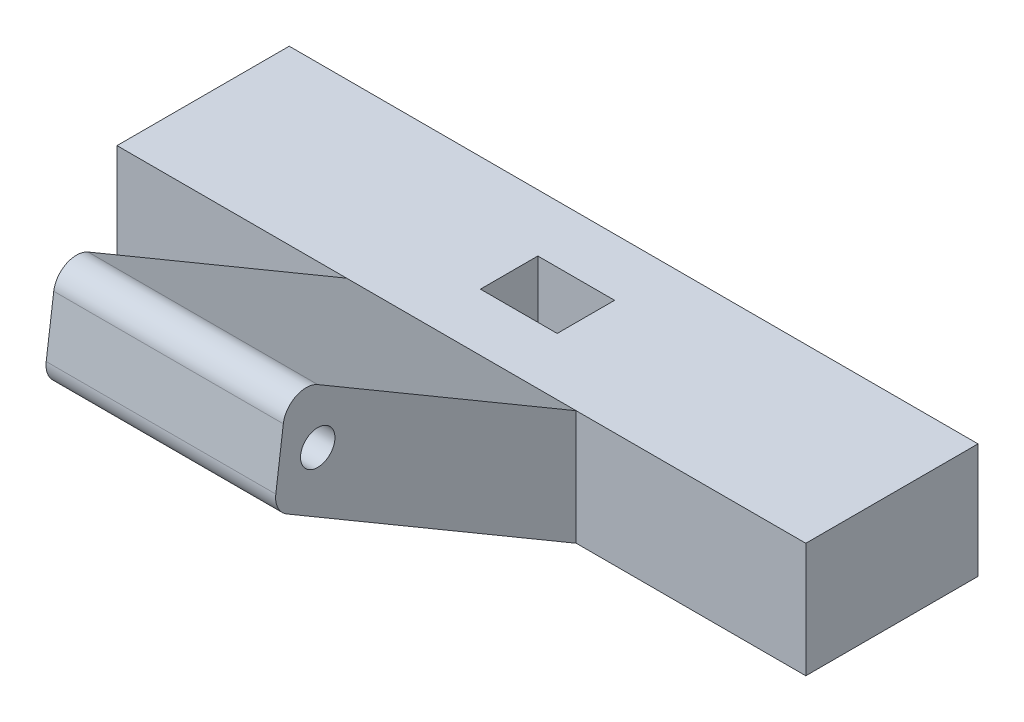
ISO-10303-21;
HEADER;
FILE_DESCRIPTION(('STEP AP214'),'2;1');
FILE_NAME('part.step','',(''),(''),'','','');
FILE_SCHEMA(('AUTOMOTIVE_DESIGN { 1 0 10303 214 1 1 1 1 }'));
ENDSEC;
DATA;
#1=APPLICATION_CONTEXT('core data for automotive mechanical design processes');
#2=APPLICATION_PROTOCOL_DEFINITION('international standard','automotive_design',2000,#1);
#3=PRODUCT_CONTEXT('',#1,'mechanical');
#4=PRODUCT('Part','Part','',(#3));
#5=PRODUCT_RELATED_PRODUCT_CATEGORY('part','',(#4));
#6=PRODUCT_DEFINITION_FORMATION('','',#4);
#7=PRODUCT_DEFINITION_CONTEXT('part definition',#1,'design');
#8=PRODUCT_DEFINITION('design','',#6,#7);
#9=PRODUCT_DEFINITION_SHAPE('','',#8);
#10=(LENGTH_UNIT() NAMED_UNIT(*) SI_UNIT(.MILLI.,.METRE.));
#11=(NAMED_UNIT(*) PLANE_ANGLE_UNIT() SI_UNIT($,.RADIAN.));
#12=(NAMED_UNIT(*) SI_UNIT($,.STERADIAN.) SOLID_ANGLE_UNIT());
#13=UNCERTAINTY_MEASURE_WITH_UNIT(LENGTH_MEASURE(1.E-05),#10,'distance_accuracy_value','');
#14=(GEOMETRIC_REPRESENTATION_CONTEXT(3) GLOBAL_UNCERTAINTY_ASSIGNED_CONTEXT((#13)) GLOBAL_UNIT_ASSIGNED_CONTEXT((#10,
#11,#12)) REPRESENTATION_CONTEXT('',''));
#15=CARTESIAN_POINT('',(0.,0.,0.));
#16=DIRECTION('',(0.,0.,1.));
#17=DIRECTION('',(1.,0.,0.));
#18=AXIS2_PLACEMENT_3D('',#15,#16,#17);
#19=CARTESIAN_POINT('',(-30.,10.,7.5));
#20=DIRECTION('',(0.,0.,-1.));
#21=DIRECTION('',(-1.,0.,0.));
#22=AXIS2_PLACEMENT_3D('',#19,#20,#21);
#23=PLANE('',#22);
#24=DIRECTION('',(0.,1.,0.));
#25=VECTOR('',#24,1.);
#26=CARTESIAN_POINT('',(10.,0.,7.5));
#27=LINE('',#26,#25);
#28=CARTESIAN_POINT('',(10.,0.,7.5));
#29=VERTEX_POINT('',#28);
#30=CARTESIAN_POINT('',(10.,10.,7.5));
#31=VERTEX_POINT('',#30);
#32=EDGE_CURVE('E217',#29,#31,#27,.T.);
#33=ORIENTED_EDGE('',*,*,#32,.F.);
#34=DIRECTION('',(1.,0.,0.));
#35=VECTOR('',#34,1.);
#36=CARTESIAN_POINT('',(-30.,0.,7.5));
#37=LINE('',#36,#35);
#38=CARTESIAN_POINT('',(30.,0.,7.5));
#39=VERTEX_POINT('',#38);
#40=EDGE_CURVE('E92',#29,#39,#37,.T.);
#41=ORIENTED_EDGE('',*,*,#40,.T.);
#42=DIRECTION('',(0.,-1.,0.));
#43=VECTOR('',#42,1.);
#44=CARTESIAN_POINT('',(30.,10.,7.5));
#45=LINE('',#44,#43);
#46=CARTESIAN_POINT('',(30.,10.,7.5));
#47=VERTEX_POINT('',#46);
#48=EDGE_CURVE('E299',#47,#39,#45,.T.);
#49=ORIENTED_EDGE('',*,*,#48,.F.);
#50=DIRECTION('',(1.,0.,0.));
#51=VECTOR('',#50,1.);
#52=CARTESIAN_POINT('',(-30.,10.,7.5));
#53=LINE('',#52,#51);
#54=EDGE_CURVE('E70',#31,#47,#53,.T.);
#55=ORIENTED_EDGE('',*,*,#54,.F.);
#56=EDGE_LOOP('',(#33,#41,#49,#55));
#57=FACE_BOUND('',#56,.T.);
#58=ADVANCED_FACE('F45',(#57),#23,.F.);
#59=CARTESIAN_POINT('',(0.,10.,0.));
#60=DIRECTION('',(0.,-1.,0.));
#61=DIRECTION('',(0.,0.,-1.));
#62=AXIS2_PLACEMENT_3D('',#59,#60,#61);
#63=PLANE('',#62);
#64=DIRECTION('',(0.,0.,1.));
#65=VECTOR('',#64,1.);
#66=CARTESIAN_POINT('',(-3.34283256,10.,2.5));
#67=LINE('',#66,#65);
#68=CARTESIAN_POINT('',(-3.34283256,10.,-2.5));
#69=VERTEX_POINT('',#68);
#70=CARTESIAN_POINT('',(-3.34283256,10.,2.5));
#71=VERTEX_POINT('',#70);
#72=EDGE_CURVE('E197',#69,#71,#67,.T.);
#73=ORIENTED_EDGE('',*,*,#72,.F.);
#74=DIRECTION('',(-1.,0.,0.));
#75=VECTOR('',#74,1.);
#76=CARTESIAN_POINT('',(-3.34283256,10.,-2.5));
#77=LINE('',#76,#75);
#78=CARTESIAN_POINT('',(3.34283256,10.,-2.5));
#79=VERTEX_POINT('',#78);
#80=EDGE_CURVE('E194',#79,#69,#77,.T.);
#81=ORIENTED_EDGE('',*,*,#80,.F.);
#82=DIRECTION('',(0.,0.,-1.));
#83=VECTOR('',#82,1.);
#84=CARTESIAN_POINT('',(3.34283256,10.,2.5));
#85=LINE('',#84,#83);
#86=CARTESIAN_POINT('',(3.34283256,10.,2.5));
#87=VERTEX_POINT('',#86);
#88=EDGE_CURVE('E175',#87,#79,#85,.T.);
#89=ORIENTED_EDGE('',*,*,#88,.F.);
#90=DIRECTION('',(1.,0.,0.));
#91=VECTOR('',#90,1.);
#92=CARTESIAN_POINT('',(-3.34283256,10.,2.5));
#93=LINE('',#92,#91);
#94=EDGE_CURVE('E170',#71,#87,#93,.T.);
#95=ORIENTED_EDGE('',*,*,#94,.F.);
#96=EDGE_LOOP('',(#73,#81,#89,#95));
#97=FACE_BOUND('',#96,.T.);
#98=DIRECTION('',(0.,0.,-1.));
#99=VECTOR('',#98,1.);
#100=CARTESIAN_POINT('',(30.,10.,7.5));
#101=LINE('',#100,#99);
#102=CARTESIAN_POINT('',(30.,10.,-7.5));
#103=VERTEX_POINT('',#102);
#104=EDGE_CURVE('E286',#47,#103,#101,.T.);
#105=ORIENTED_EDGE('',*,*,#104,.T.);
#106=DIRECTION('',(-1.,0.,0.));
#107=VECTOR('',#106,1.);
#108=CARTESIAN_POINT('',(-30.,10.,-7.5));
#109=LINE('',#108,#107);
#110=CARTESIAN_POINT('',(-30.,10.,-7.5));
#111=VERTEX_POINT('',#110);
#112=EDGE_CURVE('E99',#103,#111,#109,.T.);
#113=ORIENTED_EDGE('',*,*,#112,.T.);
#114=DIRECTION('',(0.,0.,1.));
#115=VECTOR('',#114,1.);
#116=CARTESIAN_POINT('',(-30.,10.,7.5));
#117=LINE('',#116,#115);
#118=CARTESIAN_POINT('',(-30.,10.,7.5));
#119=VERTEX_POINT('',#118);
#120=EDGE_CURVE('E292',#111,#119,#117,.T.);
#121=ORIENTED_EDGE('',*,*,#120,.T.);
#122=CARTESIAN_POINT('',(-10.,10.,7.5));
#123=VERTEX_POINT('',#122);
#124=EDGE_CURVE('E295',#119,#123,#53,.T.);
#125=ORIENTED_EDGE('',*,*,#124,.T.);
#126=DIRECTION('',(1.,0.,0.));
#127=VECTOR('',#126,1.);
#128=CARTESIAN_POINT('',(-10.,10.,7.5));
#129=LINE('',#128,#127);
#130=EDGE_CURVE('E267',#123,#31,#129,.T.);
#131=ORIENTED_EDGE('',*,*,#130,.T.);
#132=ORIENTED_EDGE('',*,*,#54,.T.);
#133=EDGE_LOOP('',(#105,#113,#121,#125,#131,#132));
#134=FACE_BOUND('',#133,.T.);
#135=ADVANCED_FACE('F330',(#97,#134),#63,.F.);
#136=CARTESIAN_POINT('',(0.,0.,0.));
#137=DIRECTION('',(0.,-1.,0.));
#138=DIRECTION('',(0.,0.,-1.));
#139=AXIS2_PLACEMENT_3D('',#136,#137,#138);
#140=PLANE('',#139);
#141=DIRECTION('',(0.,0.,1.));
#142=VECTOR('',#141,1.);
#143=CARTESIAN_POINT('',(-3.34283256,0.,2.5));
#144=LINE('',#143,#142);
#145=CARTESIAN_POINT('',(-3.34283256,0.,-2.5));
#146=VERTEX_POINT('',#145);
#147=CARTESIAN_POINT('',(-3.34283256,0.,2.5));
#148=VERTEX_POINT('',#147);
#149=EDGE_CURVE('E185',#146,#148,#144,.T.);
#150=ORIENTED_EDGE('',*,*,#149,.T.);
#151=DIRECTION('',(1.,0.,0.));
#152=VECTOR('',#151,1.);
#153=CARTESIAN_POINT('',(-3.34283256,0.,2.5));
#154=LINE('',#153,#152);
#155=CARTESIAN_POINT('',(3.34283256,0.,2.5));
#156=VERTEX_POINT('',#155);
#157=EDGE_CURVE('E165',#148,#156,#154,.T.);
#158=ORIENTED_EDGE('',*,*,#157,.T.);
#159=DIRECTION('',(0.,0.,-1.));
#160=VECTOR('',#159,1.);
#161=CARTESIAN_POINT('',(3.34283256,0.,2.5));
#162=LINE('',#161,#160);
#163=CARTESIAN_POINT('',(3.34283256,0.,-2.5));
#164=VERTEX_POINT('',#163);
#165=EDGE_CURVE('E157',#156,#164,#162,.T.);
#166=ORIENTED_EDGE('',*,*,#165,.T.);
#167=DIRECTION('',(-1.,0.,0.));
#168=VECTOR('',#167,1.);
#169=CARTESIAN_POINT('',(-3.34283256,0.,-2.5));
#170=LINE('',#169,#168);
#171=EDGE_CURVE('E162',#164,#146,#170,.T.);
#172=ORIENTED_EDGE('',*,*,#171,.T.);
#173=EDGE_LOOP('',(#150,#158,#166,#172));
#174=FACE_BOUND('',#173,.T.);
#175=DIRECTION('',(0.,0.,-1.));
#176=VECTOR('',#175,1.);
#177=CARTESIAN_POINT('',(30.,0.,7.5));
#178=LINE('',#177,#176);
#179=CARTESIAN_POINT('',(30.,0.,-7.5));
#180=VERTEX_POINT('',#179);
#181=EDGE_CURVE('E271',#39,#180,#178,.T.);
#182=ORIENTED_EDGE('',*,*,#181,.F.);
#183=ORIENTED_EDGE('',*,*,#40,.F.);
#184=DIRECTION('',(1.,0.,0.));
#185=VECTOR('',#184,1.);
#186=CARTESIAN_POINT('',(-10.,0.,7.5));
#187=LINE('',#186,#185);
#188=CARTESIAN_POINT('',(-10.,0.,7.5));
#189=VERTEX_POINT('',#188);
#190=EDGE_CURVE('E268',#189,#29,#187,.T.);
#191=ORIENTED_EDGE('',*,*,#190,.F.);
#192=CARTESIAN_POINT('',(-30.,0.,7.5));
#193=VERTEX_POINT('',#192);
#194=EDGE_CURVE('E289',#193,#189,#37,.T.);
#195=ORIENTED_EDGE('',*,*,#194,.F.);
#196=DIRECTION('',(0.,0.,1.));
#197=VECTOR('',#196,1.);
#198=CARTESIAN_POINT('',(-30.,0.,7.5));
#199=LINE('',#198,#197);
#200=CARTESIAN_POINT('',(-30.,0.,-7.5));
#201=VERTEX_POINT('',#200);
#202=EDGE_CURVE('E306',#201,#193,#199,.T.);
#203=ORIENTED_EDGE('',*,*,#202,.F.);
#204=DIRECTION('',(-1.,0.,0.));
#205=VECTOR('',#204,1.);
#206=CARTESIAN_POINT('',(-30.,0.,-7.5));
#207=LINE('',#206,#205);
#208=EDGE_CURVE('E303',#180,#201,#207,.T.);
#209=ORIENTED_EDGE('',*,*,#208,.F.);
#210=EDGE_LOOP('',(#182,#183,#191,#195,#203,#209));
#211=FACE_BOUND('',#210,.T.);
#212=ADVANCED_FACE('F159',(#174,#211),#140,.T.);
#213=CARTESIAN_POINT('',(30.,10.,7.5));
#214=DIRECTION('',(-1.,0.,0.));
#215=DIRECTION('',(0.,0.,1.));
#216=AXIS2_PLACEMENT_3D('',#213,#214,#215);
#217=PLANE('',#216);
#218=ORIENTED_EDGE('',*,*,#181,.T.);
#219=DIRECTION('',(0.,-1.,0.));
#220=VECTOR('',#219,1.);
#221=CARTESIAN_POINT('',(30.,10.,-7.5));
#222=LINE('',#221,#220);
#223=EDGE_CURVE('E11',#103,#180,#222,.T.);
#224=ORIENTED_EDGE('',*,*,#223,.F.);
#225=ORIENTED_EDGE('',*,*,#104,.F.);
#226=ORIENTED_EDGE('',*,*,#48,.T.);
#227=EDGE_LOOP('',(#218,#224,#225,#226));
#228=FACE_BOUND('',#227,.T.);
#229=ADVANCED_FACE('F47',(#228),#217,.F.);
#230=CARTESIAN_POINT('',(-30.,10.,-7.5));
#231=DIRECTION('',(0.,0.,1.));
#232=DIRECTION('',(1.,0.,0.));
#233=AXIS2_PLACEMENT_3D('',#230,#231,#232);
#234=PLANE('',#233);
#235=ORIENTED_EDGE('',*,*,#208,.T.);
#236=DIRECTION('',(0.,-1.,0.));
#237=VECTOR('',#236,1.);
#238=CARTESIAN_POINT('',(-30.,10.,-7.5));
#239=LINE('',#238,#237);
#240=EDGE_CURVE('E54',#111,#201,#239,.T.);
#241=ORIENTED_EDGE('',*,*,#240,.F.);
#242=ORIENTED_EDGE('',*,*,#112,.F.);
#243=ORIENTED_EDGE('',*,*,#223,.T.);
#244=EDGE_LOOP('',(#235,#241,#242,#243));
#245=FACE_BOUND('',#244,.T.);
#246=ADVANCED_FACE('F334',(#245),#234,.F.);
#247=CARTESIAN_POINT('',(-30.,10.,7.5));
#248=DIRECTION('',(1.,0.,0.));
#249=DIRECTION('',(0.,0.,-1.));
#250=AXIS2_PLACEMENT_3D('',#247,#248,#249);
#251=PLANE('',#250);
#252=ORIENTED_EDGE('',*,*,#202,.T.);
#253=DIRECTION('',(0.,-1.,0.));
#254=VECTOR('',#253,1.);
#255=CARTESIAN_POINT('',(-30.,10.,7.5));
#256=LINE('',#255,#254);
#257=EDGE_CURVE('E314',#119,#193,#256,.T.);
#258=ORIENTED_EDGE('',*,*,#257,.F.);
#259=ORIENTED_EDGE('',*,*,#120,.F.);
#260=ORIENTED_EDGE('',*,*,#240,.T.);
#261=EDGE_LOOP('',(#252,#258,#259,#260));
#262=FACE_BOUND('',#261,.T.);
#263=ADVANCED_FACE('F322',(#262),#251,.F.);
#264=ORIENTED_EDGE('',*,*,#194,.T.);
#265=DIRECTION('',(0.,1.,0.));
#266=VECTOR('',#265,1.);
#267=CARTESIAN_POINT('',(-10.,0.,7.5));
#268=LINE('',#267,#266);
#269=EDGE_CURVE('E245',#189,#123,#268,.T.);
#270=ORIENTED_EDGE('',*,*,#269,.T.);
#271=ORIENTED_EDGE('',*,*,#124,.F.);
#272=ORIENTED_EDGE('',*,*,#257,.T.);
#273=EDGE_LOOP('',(#264,#270,#271,#272));
#274=FACE_BOUND('',#273,.T.);
#275=ADVANCED_FACE('F328',(#274),#23,.F.);
#276=CARTESIAN_POINT('',(-10.,0.,7.5));
#277=DIRECTION('',(0.,-0.862171609476739,0.506616339859157));
#278=DIRECTION('',(0.,-0.506616339859157,-0.862171609476739));
#279=AXIS2_PLACEMENT_3D('',#276,#277,#278);
#280=PLANE('',#279);
#281=ORIENTED_EDGE('',*,*,#190,.T.);
#282=DIRECTION('',(0.,-0.506616339859157,-0.862171609476739));
#283=VECTOR('',#282,1.);
#284=CARTESIAN_POINT('',(10.,0.,7.5));
#285=LINE('',#284,#283);
#286=CARTESIAN_POINT('',(10.,14.8076057402578,32.6999319191409));
#287=VERTEX_POINT('',#286);
#288=EDGE_CURVE('E237',#287,#29,#285,.T.);
#289=ORIENTED_EDGE('',*,*,#288,.F.);
#290=DIRECTION('',(1.,0.,0.));
#291=VECTOR('',#290,1.);
#292=CARTESIAN_POINT('',(-10.,14.8076057402578,32.6999319191409));
#293=LINE('',#292,#291);
#294=CARTESIAN_POINT('',(-10.,14.8076057402578,32.6999319191409));
#295=VERTEX_POINT('',#294);
#296=EDGE_CURVE('E272',#295,#287,#293,.T.);
#297=ORIENTED_EDGE('',*,*,#296,.F.);
#298=DIRECTION('',(0.,-0.506616339859157,-0.862171609476739));
#299=VECTOR('',#298,1.);
#300=CARTESIAN_POINT('',(-10.,0.,7.5));
#301=LINE('',#300,#299);
#302=EDGE_CURVE('E263',#295,#189,#301,.T.);
#303=ORIENTED_EDGE('',*,*,#302,.T.);
#304=EDGE_LOOP('',(#281,#289,#297,#303));
#305=FACE_BOUND('',#304,.T.);
#306=ADVANCED_FACE('F350',(#305),#280,.T.);
#307=CARTESIAN_POINT('',(-10.,16.5319489592113,31.6866992394226));
#308=DIRECTION('',(1.,0.,0.));
#309=DIRECTION('',(0.,0.,-1.));
#310=AXIS2_PLACEMENT_3D('',#307,#308,#309);
#311=CYLINDRICAL_SURFACE('',#310,2.);
#312=ORIENTED_EDGE('',*,*,#296,.T.);
#313=CARTESIAN_POINT('',(10.,16.5319489592113,31.6866992394226));
#314=DIRECTION('',(1.,0.,0.));
#315=DIRECTION('',(0.,0.,-1.));
#316=AXIS2_PLACEMENT_3D('',#313,#314,#315);
#317=CIRCLE('',#316,2.);
#318=CARTESIAN_POINT('',(10.,16.7938462890689,33.6694775398418));
#319=VERTEX_POINT('',#318);
#320=EDGE_CURVE('E233',#319,#287,#317,.T.);
#321=ORIENTED_EDGE('',*,*,#320,.F.);
#322=DIRECTION('',(1.,0.,0.));
#323=VECTOR('',#322,1.);
#324=CARTESIAN_POINT('',(-10.,16.7938462890689,33.6694775398418));
#325=LINE('',#324,#323);
#326=CARTESIAN_POINT('',(-10.,16.7938462890689,33.6694775398418));
#327=VERTEX_POINT('',#326);
#328=EDGE_CURVE('E275',#327,#319,#325,.T.);
#329=ORIENTED_EDGE('',*,*,#328,.F.);
#330=CARTESIAN_POINT('',(-10.,16.5319489592113,31.6866992394226));
#331=DIRECTION('',(1.,0.,0.));
#332=DIRECTION('',(0.,0.,-1.));
#333=AXIS2_PLACEMENT_3D('',#330,#331,#332);
#334=CIRCLE('',#333,2.);
#335=EDGE_CURVE('E259',#327,#295,#334,.T.);
#336=ORIENTED_EDGE('',*,*,#335,.T.);
#337=EDGE_LOOP('',(#312,#321,#329,#336));
#338=FACE_BOUND('',#337,.T.);
#339=ADVANCED_FACE('F354',(#338),#311,.T.);
#340=CARTESIAN_POINT('',(-10.,16.7938462890689,33.6694775398418));
#341=DIRECTION('',(0.,0.1309486649288,0.991389150209626));
#342=DIRECTION('',(0.,-0.991389150209626,0.1309486649288));
#343=AXIS2_PLACEMENT_3D('',#340,#341,#342);
#344=PLANE('',#343);
#345=ORIENTED_EDGE('',*,*,#328,.T.);
#346=DIRECTION('',(0.,-0.991389150209626,0.1309486649288));
#347=VECTOR('',#346,1.);
#348=CARTESIAN_POINT('',(10.,16.7938462890689,33.6694775398418));
#349=LINE('',#348,#347);
#350=CARTESIAN_POINT('',(10.,21.7683087038827,33.0124205084827));
#351=VERTEX_POINT('',#350);
#352=EDGE_CURVE('E229',#351,#319,#349,.T.);
#353=ORIENTED_EDGE('',*,*,#352,.F.);
#354=DIRECTION('',(1.,0.,0.));
#355=VECTOR('',#354,1.);
#356=CARTESIAN_POINT('',(-10.,21.7683087038827,33.0124205084827));
#357=LINE('',#356,#355);
#358=CARTESIAN_POINT('',(-10.,21.7683087038827,33.0124205084827));
#359=VERTEX_POINT('',#358);
#360=EDGE_CURVE('E278',#359,#351,#357,.T.);
#361=ORIENTED_EDGE('',*,*,#360,.F.);
#362=DIRECTION('',(0.,-0.991389150209626,0.1309486649288));
#363=VECTOR('',#362,1.);
#364=CARTESIAN_POINT('',(-10.,16.7938462890689,33.6694775398418));
#365=LINE('',#364,#363);
#366=EDGE_CURVE('E255',#359,#327,#365,.T.);
#367=ORIENTED_EDGE('',*,*,#366,.T.);
#368=EDGE_LOOP('',(#345,#353,#361,#367));
#369=FACE_BOUND('',#368,.T.);
#370=ADVANCED_FACE('F360',(#369),#344,.T.);
#371=CARTESIAN_POINT('',(-10.,21.5064113740251,31.0296422080635));
#372=DIRECTION('',(1.,0.,0.));
#373=DIRECTION('',(0.,0.,-1.));
#374=AXIS2_PLACEMENT_3D('',#371,#372,#373);
#375=CYLINDRICAL_SURFACE('',#374,2.);
#376=ORIENTED_EDGE('',*,*,#360,.T.);
#377=CARTESIAN_POINT('',(10.,21.5064113740251,31.0296422080635));
#378=DIRECTION('',(1.,0.,0.));
#379=DIRECTION('',(0.,0.,-1.));
#380=AXIS2_PLACEMENT_3D('',#377,#378,#379);
#381=CIRCLE('',#380,2.);
#382=CARTESIAN_POINT('',(10.,23.2307545929785,30.0164095283452));
#383=VERTEX_POINT('',#382);
#384=EDGE_CURVE('E225',#383,#351,#381,.T.);
#385=ORIENTED_EDGE('',*,*,#384,.F.);
#386=DIRECTION('',(1.,0.,0.));
#387=VECTOR('',#386,1.);
#388=CARTESIAN_POINT('',(-10.,23.2307545929785,30.0164095283452));
#389=LINE('',#388,#387);
#390=CARTESIAN_POINT('',(-10.,23.2307545929785,30.0164095283452));
#391=VERTEX_POINT('',#390);
#392=EDGE_CURVE('E281',#391,#383,#389,.T.);
#393=ORIENTED_EDGE('',*,*,#392,.F.);
#394=CARTESIAN_POINT('',(-10.,21.5064113740251,31.0296422080635));
#395=DIRECTION('',(1.,0.,0.));
#396=DIRECTION('',(0.,0.,-1.));
#397=AXIS2_PLACEMENT_3D('',#394,#395,#396);
#398=CIRCLE('',#397,2.);
#399=EDGE_CURVE('E251',#391,#359,#398,.T.);
#400=ORIENTED_EDGE('',*,*,#399,.T.);
#401=EDGE_LOOP('',(#376,#385,#393,#400));
#402=FACE_BOUND('',#401,.T.);
#403=ADVANCED_FACE('F369',(#402),#375,.T.);
#404=CARTESIAN_POINT('',(-10.,10.,7.5));
#405=DIRECTION('',(0.,0.862171609476739,-0.506616339859157));
#406=DIRECTION('',(0.,0.506616339859157,0.862171609476739));
#407=AXIS2_PLACEMENT_3D('',#404,#405,#406);
#408=PLANE('',#407);
#409=ORIENTED_EDGE('',*,*,#392,.T.);
#410=DIRECTION('',(0.,0.506616339859157,0.862171609476739));
#411=VECTOR('',#410,1.);
#412=CARTESIAN_POINT('',(10.,10.,7.5));
#413=LINE('',#412,#411);
#414=EDGE_CURVE('E221',#31,#383,#413,.T.);
#415=ORIENTED_EDGE('',*,*,#414,.F.);
#416=ORIENTED_EDGE('',*,*,#130,.F.);
#417=DIRECTION('',(0.,0.506616339859157,0.862171609476739));
#418=VECTOR('',#417,1.);
#419=CARTESIAN_POINT('',(-10.,10.,7.5));
#420=LINE('',#419,#418);
#421=EDGE_CURVE('E61',#123,#391,#420,.T.);
#422=ORIENTED_EDGE('',*,*,#421,.T.);
#423=EDGE_LOOP('',(#409,#415,#416,#422));
#424=FACE_BOUND('',#423,.T.);
#425=ADVANCED_FACE('F373',(#424),#408,.T.);
#426=CARTESIAN_POINT('',(-10.,21.5064113740251,31.0296422080635));
#427=DIRECTION('',(1.,0.,0.));
#428=DIRECTION('',(0.,0.,-1.));
#429=AXIS2_PLACEMENT_3D('',#426,#427,#428);
#430=PLANE('',#429);
#431=CARTESIAN_POINT('',(-10.,18.4840143958913,30.0164095283452));
#432=DIRECTION('',(1.,0.,0.));
#433=DIRECTION('',(0.,0.,-1.));
#434=AXIS2_PLACEMENT_3D('',#431,#432,#433);
#435=CIRCLE('',#434,1.5);
#436=CARTESIAN_POINT('',(-10.,18.4840143958913,28.5164095283452));
#437=VERTEX_POINT('',#436);
#438=EDGE_CURVE('E241',#437,#437,#435,.T.);
#439=ORIENTED_EDGE('',*,*,#438,.T.);
#440=EDGE_LOOP('',(#439));
#441=FACE_BOUND('',#440,.T.);
#442=ORIENTED_EDGE('',*,*,#269,.F.);
#443=ORIENTED_EDGE('',*,*,#302,.F.);
#444=ORIENTED_EDGE('',*,*,#335,.F.);
#445=ORIENTED_EDGE('',*,*,#366,.F.);
#446=ORIENTED_EDGE('',*,*,#399,.F.);
#447=ORIENTED_EDGE('',*,*,#421,.F.);
#448=EDGE_LOOP('',(#442,#443,#444,#445,#446,#447));
#449=FACE_BOUND('',#448,.T.);
#450=ADVANCED_FACE('F364',(#441,#449),#430,.F.);
#451=CARTESIAN_POINT('',(-10.,18.4840143958913,30.0164095283452));
#452=DIRECTION('',(1.,0.,0.));
#453=DIRECTION('',(0.,0.,-1.));
#454=AXIS2_PLACEMENT_3D('',#451,#452,#453);
#455=CYLINDRICAL_SURFACE('',#454,1.5);
#456=ORIENTED_EDGE('',*,*,#438,.F.);
#457=EDGE_LOOP('',(#456));
#458=FACE_BOUND('',#457,.T.);
#459=CARTESIAN_POINT('',(10.,18.4840143958913,30.0164095283452));
#460=DIRECTION('',(1.,0.,0.));
#461=DIRECTION('',(0.,0.,-1.));
#462=AXIS2_PLACEMENT_3D('',#459,#460,#461);
#463=CIRCLE('',#462,1.5);
#464=CARTESIAN_POINT('',(10.,18.4840143958913,28.5164095283452));
#465=VERTEX_POINT('',#464);
#466=EDGE_CURVE('E207',#465,#465,#463,.T.);
#467=ORIENTED_EDGE('',*,*,#466,.T.);
#468=EDGE_LOOP('',(#467));
#469=FACE_BOUND('',#468,.T.);
#470=ADVANCED_FACE('F527',(#458,#469),#455,.F.);
#471=CARTESIAN_POINT('',(10.,21.5064113740251,31.0296422080635));
#472=DIRECTION('',(1.,0.,0.));
#473=DIRECTION('',(0.,0.,-1.));
#474=AXIS2_PLACEMENT_3D('',#471,#472,#473);
#475=PLANE('',#474);
#476=ORIENTED_EDGE('',*,*,#32,.T.);
#477=ORIENTED_EDGE('',*,*,#414,.T.);
#478=ORIENTED_EDGE('',*,*,#384,.T.);
#479=ORIENTED_EDGE('',*,*,#352,.T.);
#480=ORIENTED_EDGE('',*,*,#320,.T.);
#481=ORIENTED_EDGE('',*,*,#288,.T.);
#482=EDGE_LOOP('',(#476,#477,#478,#479,#480,#481));
#483=FACE_BOUND('',#482,.T.);
#484=ORIENTED_EDGE('',*,*,#466,.F.);
#485=EDGE_LOOP('',(#484));
#486=FACE_BOUND('',#485,.T.);
#487=ADVANCED_FACE('F391',(#483,#486),#475,.T.);
#488=CARTESIAN_POINT('',(-3.34283256,0.,2.5));
#489=DIRECTION('',(-1.,0.,0.));
#490=DIRECTION('',(0.,0.,1.));
#491=AXIS2_PLACEMENT_3D('',#488,#489,#490);
#492=PLANE('',#491);
#493=DIRECTION('',(0.,1.,0.));
#494=VECTOR('',#493,1.);
#495=CARTESIAN_POINT('',(-3.34283256,0.,-2.5));
#496=LINE('',#495,#494);
#497=EDGE_CURVE('E179',#146,#69,#496,.T.);
#498=ORIENTED_EDGE('',*,*,#497,.T.);
#499=ORIENTED_EDGE('',*,*,#72,.T.);
#500=DIRECTION('',(0.,1.,0.));
#501=VECTOR('',#500,1.);
#502=CARTESIAN_POINT('',(-3.34283256,0.,2.5));
#503=LINE('',#502,#501);
#504=EDGE_CURVE('E208',#148,#71,#503,.T.);
#505=ORIENTED_EDGE('',*,*,#504,.F.);
#506=ORIENTED_EDGE('',*,*,#149,.F.);
#507=EDGE_LOOP('',(#498,#499,#505,#506));
#508=FACE_BOUND('',#507,.T.);
#509=ADVANCED_FACE('F388',(#508),#492,.F.);
#510=CARTESIAN_POINT('',(-3.34283256,0.,-2.5));
#511=DIRECTION('',(0.,0.,-1.));
#512=DIRECTION('',(-1.,0.,0.));
#513=AXIS2_PLACEMENT_3D('',#510,#511,#512);
#514=PLANE('',#513);
#515=ORIENTED_EDGE('',*,*,#80,.T.);
#516=ORIENTED_EDGE('',*,*,#497,.F.);
#517=ORIENTED_EDGE('',*,*,#171,.F.);
#518=DIRECTION('',(0.,1.,0.));
#519=VECTOR('',#518,1.);
#520=CARTESIAN_POINT('',(3.34283256,0.,-2.5));
#521=LINE('',#520,#519);
#522=EDGE_CURVE('E173',#164,#79,#521,.T.);
#523=ORIENTED_EDGE('',*,*,#522,.T.);
#524=EDGE_LOOP('',(#515,#516,#517,#523));
#525=FACE_BOUND('',#524,.T.);
#526=ADVANCED_FACE('F181',(#525),#514,.F.);
#527=CARTESIAN_POINT('',(-3.34283256,0.,2.5));
#528=DIRECTION('',(0.,0.,1.));
#529=DIRECTION('',(1.,0.,0.));
#530=AXIS2_PLACEMENT_3D('',#527,#528,#529);
#531=PLANE('',#530);
#532=ORIENTED_EDGE('',*,*,#504,.T.);
#533=ORIENTED_EDGE('',*,*,#94,.T.);
#534=DIRECTION('',(0.,1.,0.));
#535=VECTOR('',#534,1.);
#536=CARTESIAN_POINT('',(3.34283256,0.,2.5));
#537=LINE('',#536,#535);
#538=EDGE_CURVE('E204',#156,#87,#537,.T.);
#539=ORIENTED_EDGE('',*,*,#538,.F.);
#540=ORIENTED_EDGE('',*,*,#157,.F.);
#541=EDGE_LOOP('',(#532,#533,#539,#540));
#542=FACE_BOUND('',#541,.T.);
#543=ADVANCED_FACE('F400',(#542),#531,.F.);
#544=CARTESIAN_POINT('',(3.34283256,0.,2.5));
#545=DIRECTION('',(1.,0.,0.));
#546=DIRECTION('',(0.,0.,-1.));
#547=AXIS2_PLACEMENT_3D('',#544,#545,#546);
#548=PLANE('',#547);
#549=ORIENTED_EDGE('',*,*,#538,.T.);
#550=ORIENTED_EDGE('',*,*,#88,.T.);
#551=ORIENTED_EDGE('',*,*,#522,.F.);
#552=ORIENTED_EDGE('',*,*,#165,.F.);
#553=EDGE_LOOP('',(#549,#550,#551,#552));
#554=FACE_BOUND('',#553,.T.);
#555=ADVANCED_FACE('F174',(#554),#548,.F.);
#556=CLOSED_SHELL('',(#58,#135,#212,#229,#246,#263,#275,#306,#339,#370,#403,#425,#450,#470,#487,
#509,#526,#543,#555));
#557=MANIFOLD_SOLID_BREP('B2',#556);
#558=ADVANCED_BREP_SHAPE_REPRESENTATION('',(#18,#557),#14);
#559=SHAPE_DEFINITION_REPRESENTATION(#9,#558);
ENDSEC;
END-ISO-10303-21;
